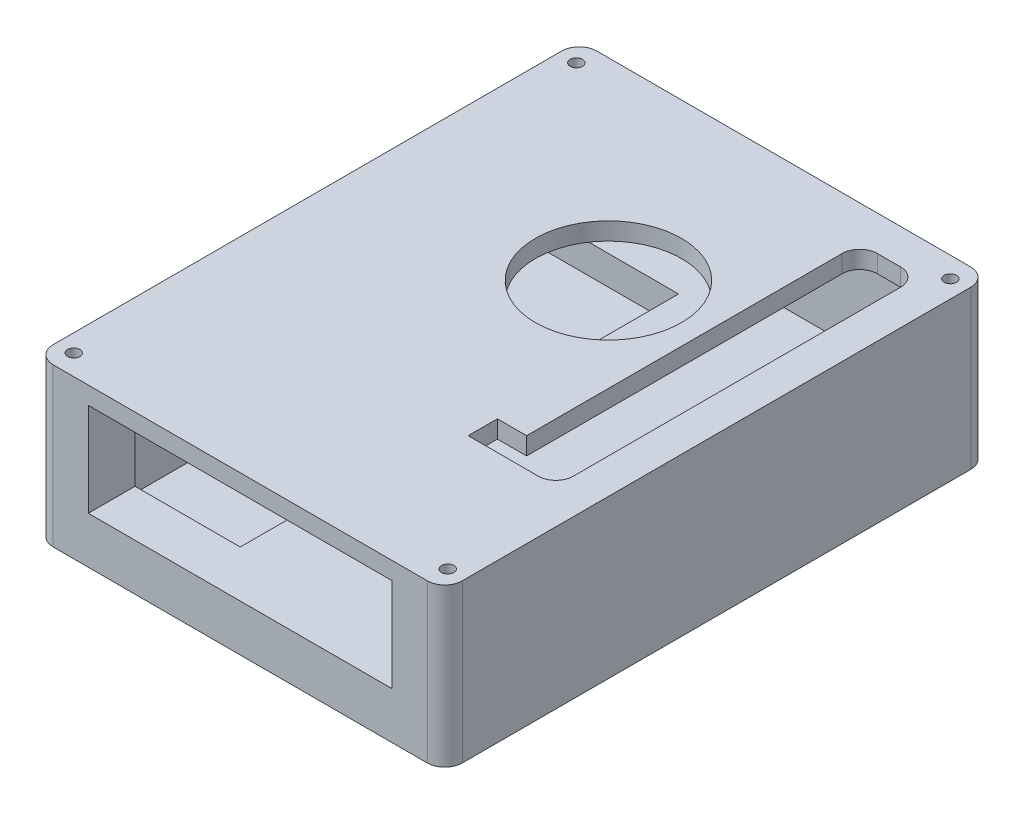
ISO-10303-21;
HEADER;
FILE_DESCRIPTION(('STEP AP214'),'2;1');
FILE_NAME('part.step','',(''),(''),'','','');
FILE_SCHEMA(('AUTOMOTIVE_DESIGN { 1 0 10303 214 1 1 1 1 }'));
ENDSEC;
DATA;
#1=APPLICATION_CONTEXT('core data for automotive mechanical design processes');
#2=APPLICATION_PROTOCOL_DEFINITION('international standard','automotive_design',2000,#1);
#3=PRODUCT_CONTEXT('',#1,'mechanical');
#4=PRODUCT('Part','Part','',(#3));
#5=PRODUCT_RELATED_PRODUCT_CATEGORY('part','',(#4));
#6=PRODUCT_DEFINITION_FORMATION('','',#4);
#7=PRODUCT_DEFINITION_CONTEXT('part definition',#1,'design');
#8=PRODUCT_DEFINITION('design','',#6,#7);
#9=PRODUCT_DEFINITION_SHAPE('','',#8);
#10=(LENGTH_UNIT() NAMED_UNIT(*) SI_UNIT(.MILLI.,.METRE.));
#11=(NAMED_UNIT(*) PLANE_ANGLE_UNIT() SI_UNIT($,.RADIAN.));
#12=(NAMED_UNIT(*) SI_UNIT($,.STERADIAN.) SOLID_ANGLE_UNIT());
#13=UNCERTAINTY_MEASURE_WITH_UNIT(LENGTH_MEASURE(1.E-05),#10,'distance_accuracy_value','');
#14=(GEOMETRIC_REPRESENTATION_CONTEXT(3) GLOBAL_UNCERTAINTY_ASSIGNED_CONTEXT((#13)) GLOBAL_UNIT_ASSIGNED_CONTEXT((#10,
#11,#12)) REPRESENTATION_CONTEXT('',''));
#15=CARTESIAN_POINT('',(0.,0.,0.));
#16=DIRECTION('',(0.,0.,1.));
#17=DIRECTION('',(1.,0.,0.));
#18=AXIS2_PLACEMENT_3D('',#15,#16,#17);
#19=CARTESIAN_POINT('',(26.,24.,-43.5));
#20=DIRECTION('',(1.,0.,0.));
#21=DIRECTION('',(0.,1.,0.));
#22=AXIS2_PLACEMENT_3D('',#19,#20,#21);
#23=PLANE('',#22);
#24=DIRECTION('',(0.,0.,1.));
#25=VECTOR('',#24,1.);
#26=CARTESIAN_POINT('',(26.,24.,-43.5));
#27=LINE('',#26,#25);
#28=CARTESIAN_POINT('',(26.,24.,21.5));
#29=VERTEX_POINT('',#28);
#30=CARTESIAN_POINT('',(26.,24.,46.5));
#31=VERTEX_POINT('',#30);
#32=EDGE_CURVE('E390',#29,#31,#27,.T.);
#33=ORIENTED_EDGE('',*,*,#32,.F.);
#34=DIRECTION('',(0.,1.,0.));
#35=VECTOR('',#34,1.);
#36=CARTESIAN_POINT('',(26.,-55.7887137352683,21.5));
#37=LINE('',#36,#35);
#38=CARTESIAN_POINT('',(26.,8.00000000000001,21.5));
#39=VERTEX_POINT('',#38);
#40=EDGE_CURVE('E346',#39,#29,#37,.T.);
#41=ORIENTED_EDGE('',*,*,#40,.F.);
#42=DIRECTION('',(0.,0.,1.));
#43=VECTOR('',#42,1.);
#44=CARTESIAN_POINT('',(26.,8.,-43.5));
#45=LINE('',#44,#43);
#46=CARTESIAN_POINT('',(26.,8.,46.5));
#47=VERTEX_POINT('',#46);
#48=EDGE_CURVE('E410',#39,#47,#45,.T.);
#49=ORIENTED_EDGE('',*,*,#48,.T.);
#50=DIRECTION('',(0.,1.,0.));
#51=VECTOR('',#50,1.);
#52=CARTESIAN_POINT('',(26.,24.,46.5));
#53=LINE('',#52,#51);
#54=EDGE_CURVE('E391',#47,#31,#53,.T.);
#55=ORIENTED_EDGE('',*,*,#54,.T.);
#56=EDGE_LOOP('',(#33,#41,#49,#55));
#57=FACE_BOUND('',#56,.T.);
#58=ADVANCED_FACE('F40',(#57),#23,.F.);
#59=CARTESIAN_POINT('',(-32.,27.,43.5));
#60=DIRECTION('',(0.,-1.,0.));
#61=DIRECTION('',(0.,0.,-1.));
#62=AXIS2_PLACEMENT_3D('',#59,#60,#61);
#63=CYLINDRICAL_SURFACE('',#62,3.);
#64=CARTESIAN_POINT('',(-32.,0.,43.5));
#65=DIRECTION('',(0.,1.,0.));
#66=DIRECTION('',(0.,0.,-1.));
#67=AXIS2_PLACEMENT_3D('',#64,#65,#66);
#68=CIRCLE('',#67,3.);
#69=CARTESIAN_POINT('',(-35.,0.,43.5));
#70=VERTEX_POINT('',#69);
#71=CARTESIAN_POINT('',(-32.,0.,46.5));
#72=VERTEX_POINT('',#71);
#73=EDGE_CURVE('E453',#70,#72,#68,.T.);
#74=ORIENTED_EDGE('',*,*,#73,.T.);
#75=DIRECTION('',(0.,-1.,0.));
#76=VECTOR('',#75,1.);
#77=CARTESIAN_POINT('',(-32.,27.,46.5));
#78=LINE('',#77,#76);
#79=CARTESIAN_POINT('',(-32.,27.,46.5));
#80=VERTEX_POINT('',#79);
#81=EDGE_CURVE('E253',#80,#72,#78,.T.);
#82=ORIENTED_EDGE('',*,*,#81,.F.);
#83=CARTESIAN_POINT('',(-32.,27.,43.5));
#84=DIRECTION('',(0.,1.,0.));
#85=DIRECTION('',(0.,0.,-1.));
#86=AXIS2_PLACEMENT_3D('',#83,#84,#85);
#87=CIRCLE('',#86,3.);
#88=CARTESIAN_POINT('',(-35.,27.,43.5));
#89=VERTEX_POINT('',#88);
#90=EDGE_CURVE('E462',#89,#80,#87,.T.);
#91=ORIENTED_EDGE('',*,*,#90,.F.);
#92=DIRECTION('',(0.,-1.,0.));
#93=VECTOR('',#92,1.);
#94=CARTESIAN_POINT('',(-35.,27.,43.5));
#95=LINE('',#94,#93);
#96=EDGE_CURVE('E488',#89,#70,#95,.T.);
#97=ORIENTED_EDGE('',*,*,#96,.T.);
#98=EDGE_LOOP('',(#74,#82,#91,#97));
#99=FACE_BOUND('',#98,.T.);
#100=ADVANCED_FACE('F42',(#99),#63,.T.);
#101=CARTESIAN_POINT('',(-32.,27.,46.5));
#102=DIRECTION('',(0.,0.,-1.));
#103=DIRECTION('',(-1.,0.,0.));
#104=AXIS2_PLACEMENT_3D('',#101,#102,#103);
#105=PLANE('',#104);
#106=DIRECTION('',(-1.,0.,0.));
#107=VECTOR('',#106,1.);
#108=CARTESIAN_POINT('',(-26.,24.,46.5));
#109=LINE('',#108,#107);
#110=CARTESIAN_POINT('',(-26.,24.,46.5));
#111=VERTEX_POINT('',#110);
#112=EDGE_CURVE('E395',#31,#111,#109,.T.);
#113=ORIENTED_EDGE('',*,*,#112,.F.);
#114=ORIENTED_EDGE('',*,*,#54,.F.);
#115=DIRECTION('',(1.,0.,0.));
#116=VECTOR('',#115,1.);
#117=CARTESIAN_POINT('',(-26.,8.,46.5));
#118=LINE('',#117,#116);
#119=CARTESIAN_POINT('',(-26.,8.,46.5));
#120=VERTEX_POINT('',#119);
#121=EDGE_CURVE('E378',#120,#47,#118,.T.);
#122=ORIENTED_EDGE('',*,*,#121,.F.);
#123=DIRECTION('',(0.,-1.,0.));
#124=VECTOR('',#123,1.);
#125=CARTESIAN_POINT('',(-26.,24.,46.5));
#126=LINE('',#125,#124);
#127=EDGE_CURVE('E399',#111,#120,#126,.T.);
#128=ORIENTED_EDGE('',*,*,#127,.F.);
#129=EDGE_LOOP('',(#113,#114,#122,#128));
#130=FACE_BOUND('',#129,.T.);
#131=DIRECTION('',(1.,0.,0.));
#132=VECTOR('',#131,1.);
#133=CARTESIAN_POINT('',(-32.,0.,46.5));
#134=LINE('',#133,#132);
#135=CARTESIAN_POINT('',(32.,0.,46.5));
#136=VERTEX_POINT('',#135);
#137=EDGE_CURVE('E492',#72,#136,#134,.T.);
#138=ORIENTED_EDGE('',*,*,#137,.T.);
#139=DIRECTION('',(0.,-1.,0.));
#140=VECTOR('',#139,1.);
#141=CARTESIAN_POINT('',(32.,27.,46.5));
#142=LINE('',#141,#140);
#143=CARTESIAN_POINT('',(32.,27.,46.5));
#144=VERTEX_POINT('',#143);
#145=EDGE_CURVE('E535',#144,#136,#142,.T.);
#146=ORIENTED_EDGE('',*,*,#145,.F.);
#147=DIRECTION('',(1.,0.,0.));
#148=VECTOR('',#147,1.);
#149=CARTESIAN_POINT('',(-32.,27.,46.5));
#150=LINE('',#149,#148);
#151=EDGE_CURVE('E466',#80,#144,#150,.T.);
#152=ORIENTED_EDGE('',*,*,#151,.F.);
#153=ORIENTED_EDGE('',*,*,#81,.T.);
#154=EDGE_LOOP('',(#138,#146,#152,#153));
#155=FACE_BOUND('',#154,.T.);
#156=ADVANCED_FACE('F623',(#130,#155),#105,.F.);
#157=CARTESIAN_POINT('',(32.,27.,43.5));
#158=DIRECTION('',(0.,-1.,0.));
#159=DIRECTION('',(0.,0.,-1.));
#160=AXIS2_PLACEMENT_3D('',#157,#158,#159);
#161=CYLINDRICAL_SURFACE('',#160,3.);
#162=CARTESIAN_POINT('',(32.,0.,43.5));
#163=DIRECTION('',(0.,1.,0.));
#164=DIRECTION('',(0.,0.,1.));
#165=AXIS2_PLACEMENT_3D('',#162,#163,#164);
#166=CIRCLE('',#165,3.);
#167=CARTESIAN_POINT('',(35.,0.,43.5));
#168=VERTEX_POINT('',#167);
#169=EDGE_CURVE('E495',#136,#168,#166,.T.);
#170=ORIENTED_EDGE('',*,*,#169,.T.);
#171=DIRECTION('',(0.,-1.,0.));
#172=VECTOR('',#171,1.);
#173=CARTESIAN_POINT('',(35.,27.,43.5));
#174=LINE('',#173,#172);
#175=CARTESIAN_POINT('',(35.,27.,43.5));
#176=VERTEX_POINT('',#175);
#177=EDGE_CURVE('E531',#176,#168,#174,.T.);
#178=ORIENTED_EDGE('',*,*,#177,.F.);
#179=CARTESIAN_POINT('',(32.,27.,43.5));
#180=DIRECTION('',(0.,1.,0.));
#181=DIRECTION('',(0.,0.,1.));
#182=AXIS2_PLACEMENT_3D('',#179,#180,#181);
#183=CIRCLE('',#182,3.);
#184=EDGE_CURVE('E470',#144,#176,#183,.T.);
#185=ORIENTED_EDGE('',*,*,#184,.F.);
#186=ORIENTED_EDGE('',*,*,#145,.T.);
#187=EDGE_LOOP('',(#170,#178,#185,#186));
#188=FACE_BOUND('',#187,.T.);
#189=ADVANCED_FACE('F702',(#188),#161,.T.);
#190=CARTESIAN_POINT('',(35.,27.,43.5));
#191=DIRECTION('',(-1.,0.,0.));
#192=DIRECTION('',(0.,0.,1.));
#193=AXIS2_PLACEMENT_3D('',#190,#191,#192);
#194=PLANE('',#193);
#195=DIRECTION('',(0.,0.,-1.));
#196=VECTOR('',#195,1.);
#197=CARTESIAN_POINT('',(35.,0.,43.5));
#198=LINE('',#197,#196);
#199=CARTESIAN_POINT('',(35.,0.,-43.5));
#200=VERTEX_POINT('',#199);
#201=EDGE_CURVE('E498',#168,#200,#198,.T.);
#202=ORIENTED_EDGE('',*,*,#201,.T.);
#203=DIRECTION('',(0.,-1.,0.));
#204=VECTOR('',#203,1.);
#205=CARTESIAN_POINT('',(35.,27.,-43.5));
#206=LINE('',#205,#204);
#207=CARTESIAN_POINT('',(35.,27.,-43.5));
#208=VERTEX_POINT('',#207);
#209=EDGE_CURVE('E527',#208,#200,#206,.T.);
#210=ORIENTED_EDGE('',*,*,#209,.F.);
#211=DIRECTION('',(0.,0.,-1.));
#212=VECTOR('',#211,1.);
#213=CARTESIAN_POINT('',(35.,27.,43.5));
#214=LINE('',#213,#212);
#215=EDGE_CURVE('E473',#176,#208,#214,.T.);
#216=ORIENTED_EDGE('',*,*,#215,.F.);
#217=ORIENTED_EDGE('',*,*,#177,.T.);
#218=EDGE_LOOP('',(#202,#210,#216,#217));
#219=FACE_BOUND('',#218,.T.);
#220=ADVANCED_FACE('F698',(#219),#194,.F.);
#221=CARTESIAN_POINT('',(32.,27.,-43.5));
#222=DIRECTION('',(0.,-1.,0.));
#223=DIRECTION('',(0.,0.,-1.));
#224=AXIS2_PLACEMENT_3D('',#221,#222,#223);
#225=CYLINDRICAL_SURFACE('',#224,3.);
#226=CARTESIAN_POINT('',(32.,0.,-43.5));
#227=DIRECTION('',(0.,1.,0.));
#228=DIRECTION('',(0.,0.,-1.));
#229=AXIS2_PLACEMENT_3D('',#226,#227,#228);
#230=CIRCLE('',#229,3.);
#231=CARTESIAN_POINT('',(32.,0.,-46.5));
#232=VERTEX_POINT('',#231);
#233=EDGE_CURVE('E501',#200,#232,#230,.T.);
#234=ORIENTED_EDGE('',*,*,#233,.T.);
#235=DIRECTION('',(0.,-1.,0.));
#236=VECTOR('',#235,1.);
#237=CARTESIAN_POINT('',(32.,27.,-46.5));
#238=LINE('',#237,#236);
#239=CARTESIAN_POINT('',(32.,27.,-46.5));
#240=VERTEX_POINT('',#239);
#241=EDGE_CURVE('E523',#240,#232,#238,.T.);
#242=ORIENTED_EDGE('',*,*,#241,.F.);
#243=CARTESIAN_POINT('',(32.,27.,-43.5));
#244=DIRECTION('',(0.,1.,0.));
#245=DIRECTION('',(0.,0.,-1.));
#246=AXIS2_PLACEMENT_3D('',#243,#244,#245);
#247=CIRCLE('',#246,3.);
#248=EDGE_CURVE('E476',#208,#240,#247,.T.);
#249=ORIENTED_EDGE('',*,*,#248,.F.);
#250=ORIENTED_EDGE('',*,*,#209,.T.);
#251=EDGE_LOOP('',(#234,#242,#249,#250));
#252=FACE_BOUND('',#251,.T.);
#253=ADVANCED_FACE('F694',(#252),#225,.T.);
#254=CARTESIAN_POINT('',(-32.,27.,-46.5));
#255=DIRECTION('',(0.,0.,1.));
#256=DIRECTION('',(1.,0.,0.));
#257=AXIS2_PLACEMENT_3D('',#254,#255,#256);
#258=PLANE('',#257);
#259=DIRECTION('',(-1.,0.,0.));
#260=VECTOR('',#259,1.);
#261=CARTESIAN_POINT('',(-32.,0.,-46.5));
#262=LINE('',#261,#260);
#263=CARTESIAN_POINT('',(-32.,0.,-46.5));
#264=VERTEX_POINT('',#263);
#265=EDGE_CURVE('E504',#232,#264,#262,.T.);
#266=ORIENTED_EDGE('',*,*,#265,.T.);
#267=DIRECTION('',(0.,-1.,0.));
#268=VECTOR('',#267,1.);
#269=CARTESIAN_POINT('',(-32.,27.,-46.5));
#270=LINE('',#269,#268);
#271=CARTESIAN_POINT('',(-32.,27.,-46.5));
#272=VERTEX_POINT('',#271);
#273=EDGE_CURVE('E519',#272,#264,#270,.T.);
#274=ORIENTED_EDGE('',*,*,#273,.F.);
#275=DIRECTION('',(-1.,0.,0.));
#276=VECTOR('',#275,1.);
#277=CARTESIAN_POINT('',(-32.,27.,-46.5));
#278=LINE('',#277,#276);
#279=EDGE_CURVE('E479',#240,#272,#278,.T.);
#280=ORIENTED_EDGE('',*,*,#279,.F.);
#281=ORIENTED_EDGE('',*,*,#241,.T.);
#282=EDGE_LOOP('',(#266,#274,#280,#281));
#283=FACE_BOUND('',#282,.T.);
#284=ADVANCED_FACE('F690',(#283),#258,.F.);
#285=CARTESIAN_POINT('',(-32.,27.,-43.5));
#286=DIRECTION('',(0.,-1.,0.));
#287=DIRECTION('',(0.,0.,-1.));
#288=AXIS2_PLACEMENT_3D('',#285,#286,#287);
#289=CYLINDRICAL_SURFACE('',#288,3.);
#290=CARTESIAN_POINT('',(-32.,0.,-43.5));
#291=DIRECTION('',(0.,1.,0.));
#292=DIRECTION('',(0.,0.,-1.));
#293=AXIS2_PLACEMENT_3D('',#290,#291,#292);
#294=CIRCLE('',#293,3.);
#295=CARTESIAN_POINT('',(-35.,0.,-43.5));
#296=VERTEX_POINT('',#295);
#297=EDGE_CURVE('E507',#264,#296,#294,.T.);
#298=ORIENTED_EDGE('',*,*,#297,.T.);
#299=DIRECTION('',(0.,-1.,0.));
#300=VECTOR('',#299,1.);
#301=CARTESIAN_POINT('',(-35.,27.,-43.5));
#302=LINE('',#301,#300);
#303=CARTESIAN_POINT('',(-35.,27.,-43.5));
#304=VERTEX_POINT('',#303);
#305=EDGE_CURVE('E515',#304,#296,#302,.T.);
#306=ORIENTED_EDGE('',*,*,#305,.F.);
#307=CARTESIAN_POINT('',(-32.,27.,-43.5));
#308=DIRECTION('',(0.,1.,0.));
#309=DIRECTION('',(0.,0.,-1.));
#310=AXIS2_PLACEMENT_3D('',#307,#308,#309);
#311=CIRCLE('',#310,3.);
#312=EDGE_CURVE('E482',#272,#304,#311,.T.);
#313=ORIENTED_EDGE('',*,*,#312,.F.);
#314=ORIENTED_EDGE('',*,*,#273,.T.);
#315=EDGE_LOOP('',(#298,#306,#313,#314));
#316=FACE_BOUND('',#315,.T.);
#317=ADVANCED_FACE('F686',(#316),#289,.T.);
#318=CARTESIAN_POINT('',(-35.,27.,43.5));
#319=DIRECTION('',(1.,0.,0.));
#320=DIRECTION('',(0.,0.,-1.));
#321=AXIS2_PLACEMENT_3D('',#318,#319,#320);
#322=PLANE('',#321);
#323=DIRECTION('',(0.,0.,-1.));
#324=VECTOR('',#323,1.);
#325=CARTESIAN_POINT('',(-35.,17.,-36.5));
#326=LINE('',#325,#324);
#327=CARTESIAN_POINT('',(-35.,17.,18.5));
#328=VERTEX_POINT('',#327);
#329=CARTESIAN_POINT('',(-35.,17.,-36.5));
#330=VERTEX_POINT('',#329);
#331=EDGE_CURVE('E439',#328,#330,#326,.T.);
#332=ORIENTED_EDGE('',*,*,#331,.F.);
#333=DIRECTION('',(0.,1.,0.));
#334=VECTOR('',#333,1.);
#335=CARTESIAN_POINT('',(-35.,17.,18.5));
#336=LINE('',#335,#334);
#337=CARTESIAN_POINT('',(-35.,3.,18.5));
#338=VERTEX_POINT('',#337);
#339=EDGE_CURVE('E428',#338,#328,#336,.T.);
#340=ORIENTED_EDGE('',*,*,#339,.F.);
#341=DIRECTION('',(0.,0.,1.));
#342=VECTOR('',#341,1.);
#343=CARTESIAN_POINT('',(-35.,3.,-36.5));
#344=LINE('',#343,#342);
#345=CARTESIAN_POINT('',(-35.,3.,-36.5));
#346=VERTEX_POINT('',#345);
#347=EDGE_CURVE('E432',#346,#338,#344,.T.);
#348=ORIENTED_EDGE('',*,*,#347,.F.);
#349=DIRECTION('',(0.,-1.,0.));
#350=VECTOR('',#349,1.);
#351=CARTESIAN_POINT('',(-35.,17.,-36.5));
#352=LINE('',#351,#350);
#353=EDGE_CURVE('E443',#330,#346,#352,.T.);
#354=ORIENTED_EDGE('',*,*,#353,.F.);
#355=EDGE_LOOP('',(#332,#340,#348,#354));
#356=FACE_BOUND('',#355,.T.);
#357=DIRECTION('',(0.,0.,1.));
#358=VECTOR('',#357,1.);
#359=CARTESIAN_POINT('',(-35.,0.,43.5));
#360=LINE('',#359,#358);
#361=EDGE_CURVE('E467',#296,#70,#360,.T.);
#362=ORIENTED_EDGE('',*,*,#361,.T.);
#363=ORIENTED_EDGE('',*,*,#96,.F.);
#364=DIRECTION('',(0.,0.,1.));
#365=VECTOR('',#364,1.);
#366=CARTESIAN_POINT('',(-35.,27.,43.5));
#367=LINE('',#366,#365);
#368=EDGE_CURVE('E485',#304,#89,#367,.T.);
#369=ORIENTED_EDGE('',*,*,#368,.F.);
#370=ORIENTED_EDGE('',*,*,#305,.T.);
#371=EDGE_LOOP('',(#362,#363,#369,#370));
#372=FACE_BOUND('',#371,.T.);
#373=ADVANCED_FACE('F679',(#356,#372),#322,.F.);
#374=CARTESIAN_POINT('',(-32.,27.,43.5));
#375=DIRECTION('',(0.,-1.,0.));
#376=DIRECTION('',(0.,0.,-1.));
#377=AXIS2_PLACEMENT_3D('',#374,#375,#376);
#378=PLANE('',#377);
#379=CARTESIAN_POINT('',(32.,27.,-43.));
#380=DIRECTION('',(0.,1.,0.));
#381=DIRECTION('',(0.,0.,1.));
#382=AXIS2_PLACEMENT_3D('',#379,#380,#381);
#383=CIRCLE('',#382,1.05);
#384=CARTESIAN_POINT('',(32.,27.,-41.95));
#385=VERTEX_POINT('',#384);
#386=EDGE_CURVE('E950',#385,#385,#383,.T.);
#387=ORIENTED_EDGE('',*,*,#386,.F.);
#388=EDGE_LOOP('',(#387));
#389=FACE_BOUND('',#388,.T.);
#390=CARTESIAN_POINT('',(32.,27.,43.));
#391=DIRECTION('',(0.,1.,0.));
#392=DIRECTION('',(0.,0.,1.));
#393=AXIS2_PLACEMENT_3D('',#390,#391,#392);
#394=CIRCLE('',#393,1.05);
#395=CARTESIAN_POINT('',(32.,27.,44.05));
#396=VERTEX_POINT('',#395);
#397=EDGE_CURVE('E954',#396,#396,#394,.T.);
#398=ORIENTED_EDGE('',*,*,#397,.F.);
#399=EDGE_LOOP('',(#398));
#400=FACE_BOUND('',#399,.T.);
#401=CARTESIAN_POINT('',(-32.,27.,43.));
#402=DIRECTION('',(0.,1.,0.));
#403=DIRECTION('',(0.,0.,1.));
#404=AXIS2_PLACEMENT_3D('',#401,#402,#403);
#405=CIRCLE('',#404,1.05);
#406=CARTESIAN_POINT('',(-32.,27.,44.05));
#407=VERTEX_POINT('',#406);
#408=EDGE_CURVE('E968',#407,#407,#405,.T.);
#409=ORIENTED_EDGE('',*,*,#408,.F.);
#410=EDGE_LOOP('',(#409));
#411=FACE_BOUND('',#410,.T.);
#412=CARTESIAN_POINT('',(-32.,27.,-43.));
#413=DIRECTION('',(0.,1.,0.));
#414=DIRECTION('',(0.,0.,1.));
#415=AXIS2_PLACEMENT_3D('',#412,#413,#414);
#416=CIRCLE('',#415,1.05);
#417=CARTESIAN_POINT('',(-32.,27.,-41.95));
#418=VERTEX_POINT('',#417);
#419=EDGE_CURVE('E960',#418,#418,#416,.T.);
#420=ORIENTED_EDGE('',*,*,#419,.F.);
#421=EDGE_LOOP('',(#420));
#422=FACE_BOUND('',#421,.T.);
#423=CARTESIAN_POINT('',(3.,27.,-13.5));
#424=DIRECTION('',(0.,1.,0.));
#425=DIRECTION('',(0.,0.,1.));
#426=AXIS2_PLACEMENT_3D('',#423,#424,#425);
#427=CIRCLE('',#426,12.5);
#428=CARTESIAN_POINT('',(3.,27.,-0.999999999999997));
#429=VERTEX_POINT('',#428);
#430=EDGE_CURVE('E290',#429,#429,#427,.T.);
#431=ORIENTED_EDGE('',*,*,#430,.F.);
#432=EDGE_LOOP('',(#431));
#433=FACE_BOUND('',#432,.T.);
#434=CARTESIAN_POINT('',(26.,27.,18.5));
#435=DIRECTION('',(0.,1.,0.));
#436=DIRECTION('',(0.,0.,-1.));
#437=AXIS2_PLACEMENT_3D('',#434,#435,#436);
#438=CIRCLE('',#437,3.);
#439=CARTESIAN_POINT('',(26.,27.,21.5));
#440=VERTEX_POINT('',#439);
#441=CARTESIAN_POINT('',(29.,27.,18.5));
#442=VERTEX_POINT('',#441);
#443=EDGE_CURVE('E324',#440,#442,#438,.T.);
#444=ORIENTED_EDGE('',*,*,#443,.F.);
#445=DIRECTION('',(1.,0.,0.));
#446=VECTOR('',#445,1.);
#447=CARTESIAN_POINT('',(26.,27.,21.5));
#448=LINE('',#447,#446);
#449=CARTESIAN_POINT('',(14.,27.,21.5));
#450=VERTEX_POINT('',#449);
#451=EDGE_CURVE('E300',#450,#440,#448,.T.);
#452=ORIENTED_EDGE('',*,*,#451,.F.);
#453=DIRECTION('',(0.,0.,1.));
#454=VECTOR('',#453,1.);
#455=CARTESIAN_POINT('',(14.,27.,21.5));
#456=LINE('',#455,#454);
#457=CARTESIAN_POINT('',(14.,27.,16.5));
#458=VERTEX_POINT('',#457);
#459=EDGE_CURVE('E296',#458,#450,#456,.T.);
#460=ORIENTED_EDGE('',*,*,#459,.F.);
#461=DIRECTION('',(-1.,0.,0.));
#462=VECTOR('',#461,1.);
#463=CARTESIAN_POINT('',(19.,27.,16.5));
#464=LINE('',#463,#462);
#465=CARTESIAN_POINT('',(19.,27.,16.5));
#466=VERTEX_POINT('',#465);
#467=EDGE_CURVE('E65',#466,#458,#464,.T.);
#468=ORIENTED_EDGE('',*,*,#467,.F.);
#469=DIRECTION('',(0.,0.,1.));
#470=VECTOR('',#469,1.);
#471=CARTESIAN_POINT('',(19.,27.,-37.5));
#472=LINE('',#471,#470);
#473=CARTESIAN_POINT('',(19.,27.,-37.5));
#474=VERTEX_POINT('',#473);
#475=EDGE_CURVE('E304',#474,#466,#472,.T.);
#476=ORIENTED_EDGE('',*,*,#475,.F.);
#477=CARTESIAN_POINT('',(22.,27.,-37.5));
#478=DIRECTION('',(0.,1.,0.));
#479=DIRECTION('',(0.,0.,1.));
#480=AXIS2_PLACEMENT_3D('',#477,#478,#479);
#481=CIRCLE('',#480,3.);
#482=CARTESIAN_POINT('',(22.,27.,-40.5));
#483=VERTEX_POINT('',#482);
#484=EDGE_CURVE('E308',#483,#474,#481,.T.);
#485=ORIENTED_EDGE('',*,*,#484,.F.);
#486=DIRECTION('',(-1.,0.,0.));
#487=VECTOR('',#486,1.);
#488=CARTESIAN_POINT('',(26.,27.,-40.5));
#489=LINE('',#488,#487);
#490=CARTESIAN_POINT('',(26.,27.,-40.5));
#491=VERTEX_POINT('',#490);
#492=EDGE_CURVE('E312',#491,#483,#489,.T.);
#493=ORIENTED_EDGE('',*,*,#492,.F.);
#494=CARTESIAN_POINT('',(26.,27.,-37.5));
#495=DIRECTION('',(0.,1.,0.));
#496=DIRECTION('',(0.,0.,-1.));
#497=AXIS2_PLACEMENT_3D('',#494,#495,#496);
#498=CIRCLE('',#497,3.);
#499=CARTESIAN_POINT('',(29.,27.,-37.5));
#500=VERTEX_POINT('',#499);
#501=EDGE_CURVE('E316',#500,#491,#498,.T.);
#502=ORIENTED_EDGE('',*,*,#501,.F.);
#503=DIRECTION('',(0.,0.,-1.));
#504=VECTOR('',#503,1.);
#505=CARTESIAN_POINT('',(29.,27.,-37.5));
#506=LINE('',#505,#504);
#507=EDGE_CURVE('E320',#442,#500,#506,.T.);
#508=ORIENTED_EDGE('',*,*,#507,.F.);
#509=EDGE_LOOP('',(#444,#452,#460,#468,#476,#485,#493,#502,#508));
#510=FACE_BOUND('',#509,.T.);
#511=ORIENTED_EDGE('',*,*,#90,.T.);
#512=ORIENTED_EDGE('',*,*,#151,.T.);
#513=ORIENTED_EDGE('',*,*,#184,.T.);
#514=ORIENTED_EDGE('',*,*,#215,.T.);
#515=ORIENTED_EDGE('',*,*,#248,.T.);
#516=ORIENTED_EDGE('',*,*,#279,.T.);
#517=ORIENTED_EDGE('',*,*,#312,.T.);
#518=ORIENTED_EDGE('',*,*,#368,.T.);
#519=EDGE_LOOP('',(#511,#512,#513,#514,#515,#516,#517,#518));
#520=FACE_BOUND('',#519,.T.);
#521=ADVANCED_FACE('F585',(#389,#400,#411,#422,#433,#510,#520),#378,.F.);
#522=CARTESIAN_POINT('',(-32.,0.,43.5));
#523=DIRECTION('',(0.,-1.,0.));
#524=DIRECTION('',(0.,0.,-1.));
#525=AXIS2_PLACEMENT_3D('',#522,#523,#524);
#526=PLANE('',#525);
#527=CARTESIAN_POINT('',(32.,0.,-43.));
#528=DIRECTION('',(0.,1.,0.));
#529=DIRECTION('',(0.,0.,1.));
#530=AXIS2_PLACEMENT_3D('',#527,#528,#529);
#531=CIRCLE('',#530,1.05);
#532=CARTESIAN_POINT('',(32.,0.,-41.95));
#533=VERTEX_POINT('',#532);
#534=EDGE_CURVE('E947',#533,#533,#531,.T.);
#535=ORIENTED_EDGE('',*,*,#534,.T.);
#536=EDGE_LOOP('',(#535));
#537=FACE_BOUND('',#536,.T.);
#538=CARTESIAN_POINT('',(32.,0.,43.));
#539=DIRECTION('',(0.,1.,0.));
#540=DIRECTION('',(0.,0.,1.));
#541=AXIS2_PLACEMENT_3D('',#538,#539,#540);
#542=CIRCLE('',#541,1.05);
#543=CARTESIAN_POINT('',(32.,0.,44.05));
#544=VERTEX_POINT('',#543);
#545=EDGE_CURVE('E974',#544,#544,#542,.T.);
#546=ORIENTED_EDGE('',*,*,#545,.T.);
#547=EDGE_LOOP('',(#546));
#548=FACE_BOUND('',#547,.T.);
#549=CARTESIAN_POINT('',(-32.,0.,43.));
#550=DIRECTION('',(0.,1.,0.));
#551=DIRECTION('',(0.,0.,1.));
#552=AXIS2_PLACEMENT_3D('',#549,#550,#551);
#553=CIRCLE('',#552,1.05);
#554=CARTESIAN_POINT('',(-32.,0.,44.05));
#555=VERTEX_POINT('',#554);
#556=EDGE_CURVE('E963',#555,#555,#553,.T.);
#557=ORIENTED_EDGE('',*,*,#556,.T.);
#558=EDGE_LOOP('',(#557));
#559=FACE_BOUND('',#558,.T.);
#560=CARTESIAN_POINT('',(-32.,0.,-43.));
#561=DIRECTION('',(0.,1.,0.));
#562=DIRECTION('',(0.,0.,1.));
#563=AXIS2_PLACEMENT_3D('',#560,#561,#562);
#564=CIRCLE('',#563,1.05);
#565=CARTESIAN_POINT('',(-32.,0.,-41.95));
#566=VERTEX_POINT('',#565);
#567=EDGE_CURVE('E286',#566,#566,#564,.T.);
#568=ORIENTED_EDGE('',*,*,#567,.T.);
#569=EDGE_LOOP('',(#568));
#570=FACE_BOUND('',#569,.T.);
#571=ORIENTED_EDGE('',*,*,#73,.F.);
#572=ORIENTED_EDGE('',*,*,#361,.F.);
#573=ORIENTED_EDGE('',*,*,#297,.F.);
#574=ORIENTED_EDGE('',*,*,#265,.F.);
#575=ORIENTED_EDGE('',*,*,#233,.F.);
#576=ORIENTED_EDGE('',*,*,#201,.F.);
#577=ORIENTED_EDGE('',*,*,#169,.F.);
#578=ORIENTED_EDGE('',*,*,#137,.F.);
#579=EDGE_LOOP('',(#571,#572,#573,#574,#575,#576,#577,#578));
#580=FACE_BOUND('',#579,.T.);
#581=ADVANCED_FACE('F675',(#537,#548,#559,#570,#580),#526,.T.);
#582=CARTESIAN_POINT('',(-8.00000000000001,17.,18.5));
#583=DIRECTION('',(0.,0.,1.));
#584=DIRECTION('',(1.,0.,0.));
#585=AXIS2_PLACEMENT_3D('',#582,#583,#584);
#586=PLANE('',#585);
#587=DIRECTION('',(-1.,0.,0.));
#588=VECTOR('',#587,1.);
#589=CARTESIAN_POINT('',(-8.00000000000001,17.,18.5));
#590=LINE('',#589,#588);
#591=CARTESIAN_POINT('',(-30.,17.,18.5));
#592=VERTEX_POINT('',#591);
#593=EDGE_CURVE('E435',#592,#328,#590,.T.);
#594=ORIENTED_EDGE('',*,*,#593,.F.);
#595=DIRECTION('',(0.,1.,0.));
#596=VECTOR('',#595,1.);
#597=CARTESIAN_POINT('',(-30.,17.,18.5));
#598=LINE('',#597,#596);
#599=CARTESIAN_POINT('',(-30.,3.,18.5));
#600=VERTEX_POINT('',#599);
#601=EDGE_CURVE('E269',#600,#592,#598,.T.);
#602=ORIENTED_EDGE('',*,*,#601,.F.);
#603=DIRECTION('',(-1.,0.,0.));
#604=VECTOR('',#603,1.);
#605=CARTESIAN_POINT('',(-8.00000000000001,3.,18.5));
#606=LINE('',#605,#604);
#607=EDGE_CURVE('E450',#600,#338,#606,.T.);
#608=ORIENTED_EDGE('',*,*,#607,.T.);
#609=ORIENTED_EDGE('',*,*,#339,.T.);
#610=EDGE_LOOP('',(#594,#602,#608,#609));
#611=FACE_BOUND('',#610,.T.);
#612=ADVANCED_FACE('F668',(#611),#586,.F.);
#613=CARTESIAN_POINT('',(-8.00000000000001,3.,-36.5));
#614=DIRECTION('',(0.,-1.,0.));
#615=DIRECTION('',(0.,0.,-1.));
#616=AXIS2_PLACEMENT_3D('',#613,#614,#615);
#617=PLANE('',#616);
#618=ORIENTED_EDGE('',*,*,#347,.T.);
#619=ORIENTED_EDGE('',*,*,#607,.F.);
#620=DIRECTION('',(0.,0.,-1.));
#621=VECTOR('',#620,1.);
#622=CARTESIAN_POINT('',(-30.,3.,38.5));
#623=LINE('',#622,#621);
#624=CARTESIAN_POINT('',(-30.,3.,38.5));
#625=VERTEX_POINT('',#624);
#626=EDGE_CURVE('E282',#625,#600,#623,.T.);
#627=ORIENTED_EDGE('',*,*,#626,.F.);
#628=DIRECTION('',(-1.,0.,0.));
#629=VECTOR('',#628,1.);
#630=CARTESIAN_POINT('',(-30.,3.,38.5));
#631=LINE('',#630,#629);
#632=CARTESIAN_POINT('',(-8.00000000000001,3.,38.5));
#633=VERTEX_POINT('',#632);
#634=EDGE_CURVE('E263',#633,#625,#631,.T.);
#635=ORIENTED_EDGE('',*,*,#634,.F.);
#636=DIRECTION('',(0.,0.,1.));
#637=VECTOR('',#636,1.);
#638=CARTESIAN_POINT('',(-8.00000000000001,3.,-36.5));
#639=LINE('',#638,#637);
#640=CARTESIAN_POINT('',(-8.00000000000001,3.,-36.5));
#641=VERTEX_POINT('',#640);
#642=EDGE_CURVE('E259',#641,#633,#639,.T.);
#643=ORIENTED_EDGE('',*,*,#642,.F.);
#644=DIRECTION('',(-1.,0.,0.));
#645=VECTOR('',#644,1.);
#646=CARTESIAN_POINT('',(-8.00000000000001,3.,-36.5));
#647=LINE('',#646,#645);
#648=EDGE_CURVE('E454',#641,#346,#647,.T.);
#649=ORIENTED_EDGE('',*,*,#648,.T.);
#650=EDGE_LOOP('',(#618,#619,#627,#635,#643,#649));
#651=FACE_BOUND('',#650,.T.);
#652=ADVANCED_FACE('F665',(#651),#617,.F.);
#653=CARTESIAN_POINT('',(-8.00000000000001,17.,-36.5));
#654=DIRECTION('',(0.,0.,-1.));
#655=DIRECTION('',(-1.,0.,0.));
#656=AXIS2_PLACEMENT_3D('',#653,#654,#655);
#657=PLANE('',#656);
#658=DIRECTION('',(0.,-1.,0.));
#659=VECTOR('',#658,1.);
#660=CARTESIAN_POINT('',(-8.00000000000001,17.,-36.5));
#661=LINE('',#660,#659);
#662=CARTESIAN_POINT('',(-8.00000000000001,8.,-36.5));
#663=VERTEX_POINT('',#662);
#664=EDGE_CURVE('E429',#663,#641,#661,.T.);
#665=ORIENTED_EDGE('',*,*,#664,.F.);
#666=DIRECTION('',(-1.,0.,0.));
#667=VECTOR('',#666,1.);
#668=CARTESIAN_POINT('',(-8.00000000000001,8.,-36.5));
#669=LINE('',#668,#667);
#670=CARTESIAN_POINT('',(-26.,8.,-36.5));
#671=VERTEX_POINT('',#670);
#672=EDGE_CURVE('E248',#663,#671,#669,.T.);
#673=ORIENTED_EDGE('',*,*,#672,.T.);
#674=DIRECTION('',(0.,1.,0.));
#675=VECTOR('',#674,1.);
#676=CARTESIAN_POINT('',(-26.,17.,-36.5));
#677=LINE('',#676,#675);
#678=CARTESIAN_POINT('',(-26.,17.,-36.5));
#679=VERTEX_POINT('',#678);
#680=EDGE_CURVE('E424',#671,#679,#677,.T.);
#681=ORIENTED_EDGE('',*,*,#680,.T.);
#682=DIRECTION('',(-1.,0.,0.));
#683=VECTOR('',#682,1.);
#684=CARTESIAN_POINT('',(-8.00000000000001,17.,-36.5));
#685=LINE('',#684,#683);
#686=EDGE_CURVE('E457',#679,#330,#685,.T.);
#687=ORIENTED_EDGE('',*,*,#686,.T.);
#688=ORIENTED_EDGE('',*,*,#353,.T.);
#689=ORIENTED_EDGE('',*,*,#648,.F.);
#690=EDGE_LOOP('',(#665,#673,#681,#687,#688,#689));
#691=FACE_BOUND('',#690,.T.);
#692=ADVANCED_FACE('F661',(#691),#657,.F.);
#693=CARTESIAN_POINT('',(-8.00000000000001,17.,-36.5));
#694=DIRECTION('',(0.,1.,0.));
#695=DIRECTION('',(0.,0.,1.));
#696=AXIS2_PLACEMENT_3D('',#693,#694,#695);
#697=PLANE('',#696);
#698=ORIENTED_EDGE('',*,*,#686,.F.);
#699=DIRECTION('',(0.,0.,1.));
#700=VECTOR('',#699,1.);
#701=CARTESIAN_POINT('',(-26.,17.,-36.5));
#702=LINE('',#701,#700);
#703=CARTESIAN_POINT('',(-26.,17.,38.5));
#704=VERTEX_POINT('',#703);
#705=EDGE_CURVE('E252',#679,#704,#702,.T.);
#706=ORIENTED_EDGE('',*,*,#705,.T.);
#707=DIRECTION('',(1.,0.,0.));
#708=VECTOR('',#707,1.);
#709=CARTESIAN_POINT('',(-26.,17.,38.5));
#710=LINE('',#709,#708);
#711=CARTESIAN_POINT('',(-30.,17.,38.5));
#712=VERTEX_POINT('',#711);
#713=EDGE_CURVE('E279',#712,#704,#710,.T.);
#714=ORIENTED_EDGE('',*,*,#713,.F.);
#715=DIRECTION('',(0.,0.,-1.));
#716=VECTOR('',#715,1.);
#717=CARTESIAN_POINT('',(-30.,17.,38.5));
#718=LINE('',#717,#716);
#719=EDGE_CURVE('E287',#712,#592,#718,.T.);
#720=ORIENTED_EDGE('',*,*,#719,.T.);
#721=ORIENTED_EDGE('',*,*,#593,.T.);
#722=ORIENTED_EDGE('',*,*,#331,.T.);
#723=EDGE_LOOP('',(#698,#706,#714,#720,#721,#722));
#724=FACE_BOUND('',#723,.T.);
#725=ADVANCED_FACE('F657',(#724),#697,.F.);
#726=CARTESIAN_POINT('',(-8.00000000000001,0.,0.));
#727=DIRECTION('',(-1.,0.,0.));
#728=DIRECTION('',(0.,0.,1.));
#729=AXIS2_PLACEMENT_3D('',#726,#727,#728);
#730=PLANE('',#729);
#731=DIRECTION('',(0.,0.,1.));
#732=VECTOR('',#731,1.);
#733=CARTESIAN_POINT('',(-8.00000000000001,8.,0.));
#734=LINE('',#733,#732);
#735=CARTESIAN_POINT('',(-8.00000000000001,8.,38.5));
#736=VERTEX_POINT('',#735);
#737=EDGE_CURVE('E241',#663,#736,#734,.T.);
#738=ORIENTED_EDGE('',*,*,#737,.F.);
#739=ORIENTED_EDGE('',*,*,#664,.T.);
#740=ORIENTED_EDGE('',*,*,#642,.T.);
#741=DIRECTION('',(0.,-1.,0.));
#742=VECTOR('',#741,1.);
#743=CARTESIAN_POINT('',(-8.00000000000001,3.,38.5));
#744=LINE('',#743,#742);
#745=EDGE_CURVE('E256',#736,#633,#744,.T.);
#746=ORIENTED_EDGE('',*,*,#745,.F.);
#747=EDGE_LOOP('',(#738,#739,#740,#746));
#748=FACE_BOUND('',#747,.T.);
#749=ADVANCED_FACE('F257',(#748),#730,.T.);
#750=CARTESIAN_POINT('',(-26.,24.,-43.5));
#751=DIRECTION('',(-1.,0.,0.));
#752=DIRECTION('',(0.,-1.,0.));
#753=AXIS2_PLACEMENT_3D('',#750,#751,#752);
#754=PLANE('',#753);
#755=DIRECTION('',(0.,-1.,0.));
#756=VECTOR('',#755,1.);
#757=CARTESIAN_POINT('',(-26.,8.,38.5));
#758=LINE('',#757,#756);
#759=CARTESIAN_POINT('',(-26.,8.,38.5));
#760=VERTEX_POINT('',#759);
#761=EDGE_CURVE('E57',#704,#760,#758,.T.);
#762=ORIENTED_EDGE('',*,*,#761,.F.);
#763=ORIENTED_EDGE('',*,*,#705,.F.);
#764=ORIENTED_EDGE('',*,*,#680,.F.);
#765=DIRECTION('',(0.,0.,1.));
#766=VECTOR('',#765,1.);
#767=CARTESIAN_POINT('',(-26.,8.,-43.5));
#768=LINE('',#767,#766);
#769=CARTESIAN_POINT('',(-26.,8.,-43.5));
#770=VERTEX_POINT('',#769);
#771=EDGE_CURVE('E411',#770,#671,#768,.T.);
#772=ORIENTED_EDGE('',*,*,#771,.F.);
#773=DIRECTION('',(0.,-1.,0.));
#774=VECTOR('',#773,1.);
#775=CARTESIAN_POINT('',(-26.,24.,-43.5));
#776=LINE('',#775,#774);
#777=CARTESIAN_POINT('',(-26.,24.,-43.5));
#778=VERTEX_POINT('',#777);
#779=EDGE_CURVE('E382',#778,#770,#776,.T.);
#780=ORIENTED_EDGE('',*,*,#779,.F.);
#781=DIRECTION('',(0.,0.,1.));
#782=VECTOR('',#781,1.);
#783=CARTESIAN_POINT('',(-26.,24.,-43.5));
#784=LINE('',#783,#782);
#785=EDGE_CURVE('E415',#778,#111,#784,.T.);
#786=ORIENTED_EDGE('',*,*,#785,.T.);
#787=ORIENTED_EDGE('',*,*,#127,.T.);
#788=EDGE_CURVE('E414',#760,#120,#768,.T.);
#789=ORIENTED_EDGE('',*,*,#788,.F.);
#790=EDGE_LOOP('',(#762,#763,#764,#772,#780,#786,#787,#789));
#791=FACE_BOUND('',#790,.T.);
#792=ADVANCED_FACE('F620',(#791),#754,.F.);
#793=CARTESIAN_POINT('',(-26.,8.,-43.5));
#794=DIRECTION('',(0.,-1.,0.));
#795=DIRECTION('',(0.,0.,-1.));
#796=AXIS2_PLACEMENT_3D('',#793,#794,#795);
#797=PLANE('',#796);
#798=ORIENTED_EDGE('',*,*,#737,.T.);
#799=DIRECTION('',(1.,0.,0.));
#800=VECTOR('',#799,1.);
#801=CARTESIAN_POINT('',(-8.00000000000001,8.,38.5));
#802=LINE('',#801,#800);
#803=EDGE_CURVE('E244',#760,#736,#802,.T.);
#804=ORIENTED_EDGE('',*,*,#803,.F.);
#805=ORIENTED_EDGE('',*,*,#788,.T.);
#806=ORIENTED_EDGE('',*,*,#121,.T.);
#807=ORIENTED_EDGE('',*,*,#48,.F.);
#808=CARTESIAN_POINT('',(26.,8.00000000000001,18.5));
#809=DIRECTION('',(0.,-1.,0.));
#810=DIRECTION('',(0.,0.,-1.));
#811=AXIS2_PLACEMENT_3D('',#808,#809,#810);
#812=CIRCLE('',#811,3.);
#813=CARTESIAN_POINT('',(29.,8.00000000000001,18.5));
#814=VERTEX_POINT('',#813);
#815=EDGE_CURVE('E342',#39,#814,#812,.F.);
#816=ORIENTED_EDGE('',*,*,#815,.T.);
#817=DIRECTION('',(0.,0.,-1.));
#818=VECTOR('',#817,1.);
#819=CARTESIAN_POINT('',(29.,8.00000000000001,-37.5));
#820=LINE('',#819,#818);
#821=CARTESIAN_POINT('',(29.,8.00000000000001,-37.5));
#822=VERTEX_POINT('',#821);
#823=EDGE_CURVE('E337',#814,#822,#820,.T.);
#824=ORIENTED_EDGE('',*,*,#823,.T.);
#825=CARTESIAN_POINT('',(26.,8.00000000000001,-37.5));
#826=DIRECTION('',(0.,-1.,0.));
#827=DIRECTION('',(0.,0.,-1.));
#828=AXIS2_PLACEMENT_3D('',#825,#826,#827);
#829=CIRCLE('',#828,3.);
#830=CARTESIAN_POINT('',(26.,8.00000000000001,-40.5));
#831=VERTEX_POINT('',#830);
#832=EDGE_CURVE('E331',#822,#831,#829,.F.);
#833=ORIENTED_EDGE('',*,*,#832,.T.);
#834=CARTESIAN_POINT('',(26.,8.,-43.5));
#835=VERTEX_POINT('',#834);
#836=EDGE_CURVE('E406',#835,#831,#45,.T.);
#837=ORIENTED_EDGE('',*,*,#836,.F.);
#838=DIRECTION('',(1.,0.,0.));
#839=VECTOR('',#838,1.);
#840=CARTESIAN_POINT('',(-26.,8.,-43.5));
#841=LINE('',#840,#839);
#842=EDGE_CURVE('E386',#770,#835,#841,.T.);
#843=ORIENTED_EDGE('',*,*,#842,.F.);
#844=ORIENTED_EDGE('',*,*,#771,.T.);
#845=ORIENTED_EDGE('',*,*,#672,.F.);
#846=EDGE_LOOP('',(#798,#804,#805,#806,#807,#816,#824,#833,#837,#843,#844,#845));
#847=FACE_BOUND('',#846,.T.);
#848=ADVANCED_FACE('F243',(#847),#797,.F.);
#849=ORIENTED_EDGE('',*,*,#836,.T.);
#850=DIRECTION('',(0.,1.,0.));
#851=VECTOR('',#850,1.);
#852=CARTESIAN_POINT('',(26.,-55.7887137352683,-40.5));
#853=LINE('',#852,#851);
#854=CARTESIAN_POINT('',(26.,24.,-40.5));
#855=VERTEX_POINT('',#854);
#856=EDGE_CURVE('E362',#831,#855,#853,.T.);
#857=ORIENTED_EDGE('',*,*,#856,.T.);
#858=CARTESIAN_POINT('',(26.,24.,-43.5));
#859=VERTEX_POINT('',#858);
#860=EDGE_CURVE('E418',#859,#855,#27,.T.);
#861=ORIENTED_EDGE('',*,*,#860,.F.);
#862=DIRECTION('',(0.,1.,0.));
#863=VECTOR('',#862,1.);
#864=CARTESIAN_POINT('',(26.,24.,-43.5));
#865=LINE('',#864,#863);
#866=EDGE_CURVE('E373',#835,#859,#865,.T.);
#867=ORIENTED_EDGE('',*,*,#866,.F.);
#868=EDGE_LOOP('',(#849,#857,#861,#867));
#869=FACE_BOUND('',#868,.T.);
#870=ADVANCED_FACE('F575',(#869),#23,.F.);
#871=CARTESIAN_POINT('',(-26.,24.,-43.5));
#872=DIRECTION('',(0.,1.,0.));
#873=DIRECTION('',(0.,0.,1.));
#874=AXIS2_PLACEMENT_3D('',#871,#872,#873);
#875=PLANE('',#874);
#876=CARTESIAN_POINT('',(3.,24.,-13.5));
#877=DIRECTION('',(0.,1.,0.));
#878=DIRECTION('',(0.,0.,1.));
#879=AXIS2_PLACEMENT_3D('',#876,#877,#878);
#880=CIRCLE('',#879,12.5);
#881=CARTESIAN_POINT('',(3.,24.,-0.999999999999997));
#882=VERTEX_POINT('',#881);
#883=EDGE_CURVE('E44',#882,#882,#880,.T.);
#884=ORIENTED_EDGE('',*,*,#883,.T.);
#885=EDGE_LOOP('',(#884));
#886=FACE_BOUND('',#885,.T.);
#887=DIRECTION('',(0.,0.,1.));
#888=VECTOR('',#887,1.);
#889=CARTESIAN_POINT('',(14.,24.,-43.5));
#890=LINE('',#889,#888);
#891=CARTESIAN_POINT('',(14.,24.,16.5));
#892=VERTEX_POINT('',#891);
#893=CARTESIAN_POINT('',(14.,24.,21.5));
#894=VERTEX_POINT('',#893);
#895=EDGE_CURVE('E544',#892,#894,#890,.T.);
#896=ORIENTED_EDGE('',*,*,#895,.T.);
#897=DIRECTION('',(1.,0.,0.));
#898=VECTOR('',#897,1.);
#899=CARTESIAN_POINT('',(-26.,24.,21.5));
#900=LINE('',#899,#898);
#901=EDGE_CURVE('E11',#894,#29,#900,.T.);
#902=ORIENTED_EDGE('',*,*,#901,.T.);
#903=ORIENTED_EDGE('',*,*,#32,.T.);
#904=ORIENTED_EDGE('',*,*,#112,.T.);
#905=ORIENTED_EDGE('',*,*,#785,.F.);
#906=DIRECTION('',(-1.,0.,0.));
#907=VECTOR('',#906,1.);
#908=CARTESIAN_POINT('',(-26.,24.,-43.5));
#909=LINE('',#908,#907);
#910=EDGE_CURVE('E377',#859,#778,#909,.T.);
#911=ORIENTED_EDGE('',*,*,#910,.F.);
#912=ORIENTED_EDGE('',*,*,#860,.T.);
#913=DIRECTION('',(-1.,0.,0.));
#914=VECTOR('',#913,1.);
#915=CARTESIAN_POINT('',(-26.,24.,-40.5));
#916=LINE('',#915,#914);
#917=CARTESIAN_POINT('',(22.,24.,-40.5));
#918=VERTEX_POINT('',#917);
#919=EDGE_CURVE('E50',#855,#918,#916,.T.);
#920=ORIENTED_EDGE('',*,*,#919,.T.);
#921=CARTESIAN_POINT('',(22.,24.,-37.5));
#922=DIRECTION('',(0.,1.,0.));
#923=DIRECTION('',(0.,0.,1.));
#924=AXIS2_PLACEMENT_3D('',#921,#922,#923);
#925=CIRCLE('',#924,3.);
#926=CARTESIAN_POINT('',(19.,24.,-37.5));
#927=VERTEX_POINT('',#926);
#928=EDGE_CURVE('E556',#918,#927,#925,.T.);
#929=ORIENTED_EDGE('',*,*,#928,.T.);
#930=DIRECTION('',(0.,0.,1.));
#931=VECTOR('',#930,1.);
#932=CARTESIAN_POINT('',(19.,24.,-43.5));
#933=LINE('',#932,#931);
#934=CARTESIAN_POINT('',(19.,24.,16.5));
#935=VERTEX_POINT('',#934);
#936=EDGE_CURVE('E552',#927,#935,#933,.T.);
#937=ORIENTED_EDGE('',*,*,#936,.T.);
#938=DIRECTION('',(-1.,0.,0.));
#939=VECTOR('',#938,1.);
#940=CARTESIAN_POINT('',(-26.,24.,16.5));
#941=LINE('',#940,#939);
#942=EDGE_CURVE('E548',#935,#892,#941,.T.);
#943=ORIENTED_EDGE('',*,*,#942,.T.);
#944=EDGE_LOOP('',(#896,#902,#903,#904,#905,#911,#912,#920,#929,#937,#943));
#945=FACE_BOUND('',#944,.T.);
#946=ADVANCED_FACE('F563',(#886,#945),#875,.F.);
#947=CARTESIAN_POINT('',(0.,0.,-43.5));
#948=DIRECTION('',(0.,0.,1.));
#949=DIRECTION('',(1.,0.,0.));
#950=AXIS2_PLACEMENT_3D('',#947,#948,#949);
#951=PLANE('',#950);
#952=ORIENTED_EDGE('',*,*,#866,.T.);
#953=ORIENTED_EDGE('',*,*,#910,.T.);
#954=ORIENTED_EDGE('',*,*,#779,.T.);
#955=ORIENTED_EDGE('',*,*,#842,.T.);
#956=EDGE_LOOP('',(#952,#953,#954,#955));
#957=FACE_BOUND('',#956,.T.);
#958=ADVANCED_FACE('F626',(#957),#951,.T.);
#959=CARTESIAN_POINT('',(26.,-55.7887137352683,21.5));
#960=DIRECTION('',(0.,0.,1.));
#961=DIRECTION('',(1.,0.,0.));
#962=AXIS2_PLACEMENT_3D('',#959,#960,#961);
#963=PLANE('',#962);
#964=DIRECTION('',(0.,1.,0.));
#965=VECTOR('',#964,1.);
#966=CARTESIAN_POINT('',(14.,-55.7887137352683,21.5));
#967=LINE('',#966,#965);
#968=EDGE_CURVE('E347',#894,#450,#967,.T.);
#969=ORIENTED_EDGE('',*,*,#968,.T.);
#970=ORIENTED_EDGE('',*,*,#451,.T.);
#971=EDGE_CURVE('E303',#29,#440,#37,.T.);
#972=ORIENTED_EDGE('',*,*,#971,.F.);
#973=ORIENTED_EDGE('',*,*,#901,.F.);
#974=EDGE_LOOP('',(#969,#970,#972,#973));
#975=FACE_BOUND('',#974,.T.);
#976=ADVANCED_FACE('F601',(#975),#963,.F.);
#977=CARTESIAN_POINT('',(26.,-55.7887137352683,-40.5));
#978=DIRECTION('',(0.,0.,-1.));
#979=DIRECTION('',(-1.,0.,0.));
#980=AXIS2_PLACEMENT_3D('',#977,#978,#979);
#981=PLANE('',#980);
#982=EDGE_CURVE('E335',#855,#491,#853,.T.);
#983=ORIENTED_EDGE('',*,*,#982,.T.);
#984=ORIENTED_EDGE('',*,*,#492,.T.);
#985=DIRECTION('',(0.,1.,0.));
#986=VECTOR('',#985,1.);
#987=CARTESIAN_POINT('',(22.,-55.7887137352683,-40.5));
#988=LINE('',#987,#986);
#989=EDGE_CURVE('E359',#918,#483,#988,.T.);
#990=ORIENTED_EDGE('',*,*,#989,.F.);
#991=ORIENTED_EDGE('',*,*,#919,.F.);
#992=EDGE_LOOP('',(#983,#984,#990,#991));
#993=FACE_BOUND('',#992,.T.);
#994=ADVANCED_FACE('F568',(#993),#981,.F.);
#995=CARTESIAN_POINT('',(22.,-55.7887137352683,-37.5));
#996=DIRECTION('',(0.,1.,0.));
#997=DIRECTION('',(0.,0.,1.));
#998=AXIS2_PLACEMENT_3D('',#995,#996,#997);
#999=CYLINDRICAL_SURFACE('',#998,3.);
#1000=ORIENTED_EDGE('',*,*,#989,.T.);
#1001=ORIENTED_EDGE('',*,*,#484,.T.);
#1002=DIRECTION('',(0.,1.,0.));
#1003=VECTOR('',#1002,1.);
#1004=CARTESIAN_POINT('',(19.,-55.7887137352683,-37.5));
#1005=LINE('',#1004,#1003);
#1006=EDGE_CURVE('E356',#927,#474,#1005,.T.);
#1007=ORIENTED_EDGE('',*,*,#1006,.F.);
#1008=ORIENTED_EDGE('',*,*,#928,.F.);
#1009=EDGE_LOOP('',(#1000,#1001,#1007,#1008));
#1010=FACE_BOUND('',#1009,.T.);
#1011=ADVANCED_FACE('F591',(#1010),#999,.F.);
#1012=CARTESIAN_POINT('',(19.,-55.7887137352683,-37.5));
#1013=DIRECTION('',(-1.,0.,0.));
#1014=DIRECTION('',(0.,0.,1.));
#1015=AXIS2_PLACEMENT_3D('',#1012,#1013,#1014);
#1016=PLANE('',#1015);
#1017=ORIENTED_EDGE('',*,*,#1006,.T.);
#1018=ORIENTED_EDGE('',*,*,#475,.T.);
#1019=DIRECTION('',(0.,1.,0.));
#1020=VECTOR('',#1019,1.);
#1021=CARTESIAN_POINT('',(19.,-55.7887137352683,16.5));
#1022=LINE('',#1021,#1020);
#1023=EDGE_CURVE('E353',#935,#466,#1022,.T.);
#1024=ORIENTED_EDGE('',*,*,#1023,.F.);
#1025=ORIENTED_EDGE('',*,*,#936,.F.);
#1026=EDGE_LOOP('',(#1017,#1018,#1024,#1025));
#1027=FACE_BOUND('',#1026,.T.);
#1028=ADVANCED_FACE('F593',(#1027),#1016,.F.);
#1029=CARTESIAN_POINT('',(19.,-55.7887137352683,16.5));
#1030=DIRECTION('',(0.,0.,-1.));
#1031=DIRECTION('',(-1.,0.,0.));
#1032=AXIS2_PLACEMENT_3D('',#1029,#1030,#1031);
#1033=PLANE('',#1032);
#1034=ORIENTED_EDGE('',*,*,#1023,.T.);
#1035=ORIENTED_EDGE('',*,*,#467,.T.);
#1036=DIRECTION('',(0.,1.,0.));
#1037=VECTOR('',#1036,1.);
#1038=CARTESIAN_POINT('',(14.,-55.7887137352683,16.5));
#1039=LINE('',#1038,#1037);
#1040=EDGE_CURVE('E350',#892,#458,#1039,.T.);
#1041=ORIENTED_EDGE('',*,*,#1040,.F.);
#1042=ORIENTED_EDGE('',*,*,#942,.F.);
#1043=EDGE_LOOP('',(#1034,#1035,#1041,#1042));
#1044=FACE_BOUND('',#1043,.T.);
#1045=ADVANCED_FACE('F595',(#1044),#1033,.F.);
#1046=CARTESIAN_POINT('',(14.,-55.7887137352683,21.5));
#1047=DIRECTION('',(-1.,0.,0.));
#1048=DIRECTION('',(0.,0.,1.));
#1049=AXIS2_PLACEMENT_3D('',#1046,#1047,#1048);
#1050=PLANE('',#1049);
#1051=ORIENTED_EDGE('',*,*,#1040,.T.);
#1052=ORIENTED_EDGE('',*,*,#459,.T.);
#1053=ORIENTED_EDGE('',*,*,#968,.F.);
#1054=ORIENTED_EDGE('',*,*,#895,.F.);
#1055=EDGE_LOOP('',(#1051,#1052,#1053,#1054));
#1056=FACE_BOUND('',#1055,.T.);
#1057=ADVANCED_FACE('F598',(#1056),#1050,.F.);
#1058=CARTESIAN_POINT('',(26.,-55.7887137352683,18.5));
#1059=DIRECTION('',(0.,1.,0.));
#1060=DIRECTION('',(0.,0.,1.));
#1061=AXIS2_PLACEMENT_3D('',#1058,#1059,#1060);
#1062=CYLINDRICAL_SURFACE('',#1061,3.);
#1063=ORIENTED_EDGE('',*,*,#40,.T.);
#1064=ORIENTED_EDGE('',*,*,#971,.T.);
#1065=ORIENTED_EDGE('',*,*,#443,.T.);
#1066=DIRECTION('',(0.,1.,0.));
#1067=VECTOR('',#1066,1.);
#1068=CARTESIAN_POINT('',(29.,-55.7887137352683,18.5));
#1069=LINE('',#1068,#1067);
#1070=EDGE_CURVE('E341',#814,#442,#1069,.T.);
#1071=ORIENTED_EDGE('',*,*,#1070,.F.);
#1072=ORIENTED_EDGE('',*,*,#815,.F.);
#1073=EDGE_LOOP('',(#1063,#1064,#1065,#1071,#1072));
#1074=FACE_BOUND('',#1073,.T.);
#1075=ADVANCED_FACE('F614',(#1074),#1062,.F.);
#1076=CARTESIAN_POINT('',(29.,-55.7887137352683,-37.5));
#1077=DIRECTION('',(1.,0.,0.));
#1078=DIRECTION('',(0.,0.,-1.));
#1079=AXIS2_PLACEMENT_3D('',#1076,#1077,#1078);
#1080=PLANE('',#1079);
#1081=ORIENTED_EDGE('',*,*,#1070,.T.);
#1082=ORIENTED_EDGE('',*,*,#507,.T.);
#1083=DIRECTION('',(0.,1.,0.));
#1084=VECTOR('',#1083,1.);
#1085=CARTESIAN_POINT('',(29.,-55.7887137352683,-37.5));
#1086=LINE('',#1085,#1084);
#1087=EDGE_CURVE('E336',#822,#500,#1086,.T.);
#1088=ORIENTED_EDGE('',*,*,#1087,.F.);
#1089=ORIENTED_EDGE('',*,*,#823,.F.);
#1090=EDGE_LOOP('',(#1081,#1082,#1088,#1089));
#1091=FACE_BOUND('',#1090,.T.);
#1092=ADVANCED_FACE('F580',(#1091),#1080,.F.);
#1093=CARTESIAN_POINT('',(26.,-55.7887137352683,-37.5));
#1094=DIRECTION('',(0.,1.,0.));
#1095=DIRECTION('',(0.,0.,1.));
#1096=AXIS2_PLACEMENT_3D('',#1093,#1094,#1095);
#1097=CYLINDRICAL_SURFACE('',#1096,3.);
#1098=ORIENTED_EDGE('',*,*,#1087,.T.);
#1099=ORIENTED_EDGE('',*,*,#501,.T.);
#1100=ORIENTED_EDGE('',*,*,#982,.F.);
#1101=ORIENTED_EDGE('',*,*,#856,.F.);
#1102=ORIENTED_EDGE('',*,*,#832,.F.);
#1103=EDGE_LOOP('',(#1098,#1099,#1100,#1101,#1102));
#1104=FACE_BOUND('',#1103,.T.);
#1105=ADVANCED_FACE('F570',(#1104),#1097,.F.);
#1106=CARTESIAN_POINT('',(3.,-55.7887137352683,-13.5));
#1107=DIRECTION('',(0.,1.,0.));
#1108=DIRECTION('',(0.,0.,1.));
#1109=AXIS2_PLACEMENT_3D('',#1106,#1107,#1108);
#1110=CYLINDRICAL_SURFACE('',#1109,12.5);
#1111=ORIENTED_EDGE('',*,*,#430,.T.);
#1112=EDGE_LOOP('',(#1111));
#1113=FACE_BOUND('',#1112,.T.);
#1114=ORIENTED_EDGE('',*,*,#883,.F.);
#1115=EDGE_LOOP('',(#1114));
#1116=FACE_BOUND('',#1115,.T.);
#1117=ADVANCED_FACE('F858',(#1113,#1116),#1110,.F.);
#1118=CARTESIAN_POINT('',(-30.,17.,38.5));
#1119=DIRECTION('',(-1.,0.,0.));
#1120=DIRECTION('',(0.,0.,1.));
#1121=AXIS2_PLACEMENT_3D('',#1118,#1119,#1120);
#1122=PLANE('',#1121);
#1123=ORIENTED_EDGE('',*,*,#601,.T.);
#1124=ORIENTED_EDGE('',*,*,#719,.F.);
#1125=DIRECTION('',(0.,1.,0.));
#1126=VECTOR('',#1125,1.);
#1127=CARTESIAN_POINT('',(-30.,17.,38.5));
#1128=LINE('',#1127,#1126);
#1129=EDGE_CURVE('E275',#625,#712,#1128,.T.);
#1130=ORIENTED_EDGE('',*,*,#1129,.F.);
#1131=ORIENTED_EDGE('',*,*,#626,.T.);
#1132=EDGE_LOOP('',(#1123,#1124,#1130,#1131));
#1133=FACE_BOUND('',#1132,.T.);
#1134=ADVANCED_FACE('F866',(#1133),#1122,.F.);
#1135=CARTESIAN_POINT('',(0.,0.,38.5));
#1136=DIRECTION('',(0.,0.,1.));
#1137=DIRECTION('',(1.,0.,0.));
#1138=AXIS2_PLACEMENT_3D('',#1135,#1136,#1137);
#1139=PLANE('',#1138);
#1140=ORIENTED_EDGE('',*,*,#761,.T.);
#1141=ORIENTED_EDGE('',*,*,#803,.T.);
#1142=ORIENTED_EDGE('',*,*,#745,.T.);
#1143=ORIENTED_EDGE('',*,*,#634,.T.);
#1144=ORIENTED_EDGE('',*,*,#1129,.T.);
#1145=ORIENTED_EDGE('',*,*,#713,.T.);
#1146=EDGE_LOOP('',(#1140,#1141,#1142,#1143,#1144,#1145));
#1147=FACE_BOUND('',#1146,.T.);
#1148=ADVANCED_FACE('F265',(#1147),#1139,.F.);
#1149=CARTESIAN_POINT('',(-32.,0.,-43.));
#1150=DIRECTION('',(0.,1.,0.));
#1151=DIRECTION('',(0.,0.,1.));
#1152=AXIS2_PLACEMENT_3D('',#1149,#1150,#1151);
#1153=CYLINDRICAL_SURFACE('',#1152,1.05);
#1154=ORIENTED_EDGE('',*,*,#567,.F.);
#1155=EDGE_LOOP('',(#1154));
#1156=FACE_BOUND('',#1155,.T.);
#1157=ORIENTED_EDGE('',*,*,#419,.T.);
#1158=EDGE_LOOP('',(#1157));
#1159=FACE_BOUND('',#1158,.T.);
#1160=ADVANCED_FACE('F902',(#1156,#1159),#1153,.F.);
#1161=CARTESIAN_POINT('',(-32.,0.,43.));
#1162=DIRECTION('',(0.,1.,0.));
#1163=DIRECTION('',(0.,0.,1.));
#1164=AXIS2_PLACEMENT_3D('',#1161,#1162,#1163);
#1165=CYLINDRICAL_SURFACE('',#1164,1.05);
#1166=ORIENTED_EDGE('',*,*,#556,.F.);
#1167=EDGE_LOOP('',(#1166));
#1168=FACE_BOUND('',#1167,.T.);
#1169=ORIENTED_EDGE('',*,*,#408,.T.);
#1170=EDGE_LOOP('',(#1169));
#1171=FACE_BOUND('',#1170,.T.);
#1172=ADVANCED_FACE('F909',(#1168,#1171),#1165,.F.);
#1173=CARTESIAN_POINT('',(32.,0.,43.));
#1174=DIRECTION('',(0.,1.,0.));
#1175=DIRECTION('',(0.,0.,1.));
#1176=AXIS2_PLACEMENT_3D('',#1173,#1174,#1175);
#1177=CYLINDRICAL_SURFACE('',#1176,1.05);
#1178=ORIENTED_EDGE('',*,*,#545,.F.);
#1179=EDGE_LOOP('',(#1178));
#1180=FACE_BOUND('',#1179,.T.);
#1181=ORIENTED_EDGE('',*,*,#397,.T.);
#1182=EDGE_LOOP('',(#1181));
#1183=FACE_BOUND('',#1182,.T.);
#1184=ADVANCED_FACE('F918',(#1180,#1183),#1177,.F.);
#1185=CARTESIAN_POINT('',(32.,0.,-43.));
#1186=DIRECTION('',(0.,1.,0.));
#1187=DIRECTION('',(0.,0.,1.));
#1188=AXIS2_PLACEMENT_3D('',#1185,#1186,#1187);
#1189=CYLINDRICAL_SURFACE('',#1188,1.05);
#1190=ORIENTED_EDGE('',*,*,#534,.F.);
#1191=EDGE_LOOP('',(#1190));
#1192=FACE_BOUND('',#1191,.T.);
#1193=ORIENTED_EDGE('',*,*,#386,.T.);
#1194=EDGE_LOOP('',(#1193));
#1195=FACE_BOUND('',#1194,.T.);
#1196=ADVANCED_FACE('F927',(#1192,#1195),#1189,.F.);
#1197=CLOSED_SHELL('',(#58,#100,#156,#189,#220,#253,#284,#317,#373,#521,#581,#612,#652,#692,
#725,#749,#792,#848,#870,#946,#958,#976,#994,#1011,#1028,#1045,#1057,#1075,#1092,#1105,#1117,
#1134,#1148,#1160,#1172,#1184,#1196));
#1198=MANIFOLD_SOLID_BREP('B2',#1197);
#1199=ADVANCED_BREP_SHAPE_REPRESENTATION('',(#18,#1198),#14);
#1200=SHAPE_DEFINITION_REPRESENTATION(#9,#1199);
ENDSEC;
END-ISO-10303-21;
